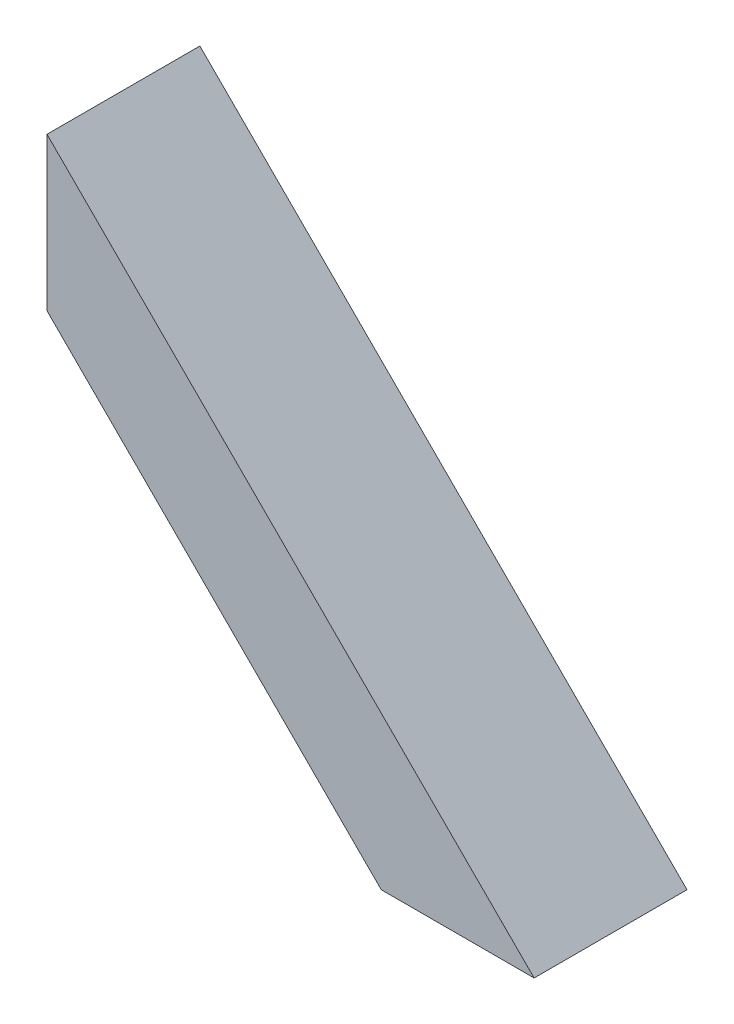
ISO-10303-21;
HEADER;
FILE_DESCRIPTION(('STEP AP214'),'2;1');
FILE_NAME('part.step','',(''),(''),'','','');
FILE_SCHEMA(('AUTOMOTIVE_DESIGN { 1 0 10303 214 1 1 1 1 }'));
ENDSEC;
DATA;
#1=APPLICATION_CONTEXT('core data for automotive mechanical design processes');
#2=APPLICATION_PROTOCOL_DEFINITION('international standard','automotive_design',2000,#1);
#3=PRODUCT_CONTEXT('',#1,'mechanical');
#4=PRODUCT('Part','Part','',(#3));
#5=PRODUCT_RELATED_PRODUCT_CATEGORY('part','',(#4));
#6=PRODUCT_DEFINITION_FORMATION('','',#4);
#7=PRODUCT_DEFINITION_CONTEXT('part definition',#1,'design');
#8=PRODUCT_DEFINITION('design','',#6,#7);
#9=PRODUCT_DEFINITION_SHAPE('','',#8);
#10=(LENGTH_UNIT() NAMED_UNIT(*) SI_UNIT(.MILLI.,.METRE.));
#11=(NAMED_UNIT(*) PLANE_ANGLE_UNIT() SI_UNIT($,.RADIAN.));
#12=(NAMED_UNIT(*) SI_UNIT($,.STERADIAN.) SOLID_ANGLE_UNIT());
#13=UNCERTAINTY_MEASURE_WITH_UNIT(LENGTH_MEASURE(1.E-05),#10,'distance_accuracy_value','');
#14=(GEOMETRIC_REPRESENTATION_CONTEXT(3) GLOBAL_UNCERTAINTY_ASSIGNED_CONTEXT((#13)) GLOBAL_UNIT_ASSIGNED_CONTEXT((#10,
#11,#12)) REPRESENTATION_CONTEXT('',''));
#15=CARTESIAN_POINT('',(0.,0.,0.));
#16=DIRECTION('',(0.,0.,1.));
#17=DIRECTION('',(1.,0.,0.));
#18=AXIS2_PLACEMENT_3D('',#15,#16,#17);
#19=CARTESIAN_POINT('',(8.74114267042818,-10.884186746988,5.));
#20=DIRECTION('',(-0.707106781186547,-0.707106781186548,0.));
#21=DIRECTION('',(0.707106781186548,-0.707106781186547,0.));
#22=AXIS2_PLACEMENT_3D('',#19,#20,#21);
#23=PLANE('',#22);
#24=DIRECTION('',(-0.707106781186548,0.707106781186547,0.));
#25=VECTOR('',#24,1.);
#26=CARTESIAN_POINT('',(8.74114267042818,-10.884186746988,0.));
#27=LINE('',#26,#25);
#28=CARTESIAN_POINT('',(8.74114267042818,-10.884186746988,0.));
#29=VERTEX_POINT('',#28);
#30=CARTESIAN_POINT('',(-7.19111445783132,5.04807038127153,0.));
#31=VERTEX_POINT('',#30);
#32=EDGE_CURVE('E107',#29,#31,#27,.T.);
#33=ORIENTED_EDGE('',*,*,#32,.T.);
#34=DIRECTION('',(0.,0.,-1.));
#35=VECTOR('',#34,1.);
#36=CARTESIAN_POINT('',(-7.19111445783132,5.04807038127153,5.));
#37=LINE('',#36,#35);
#38=CARTESIAN_POINT('',(-7.19111445783132,5.04807038127153,5.));
#39=VERTEX_POINT('',#38);
#40=EDGE_CURVE('E11',#39,#31,#37,.T.);
#41=ORIENTED_EDGE('',*,*,#40,.F.);
#42=DIRECTION('',(-0.707106781186548,0.707106781186547,0.));
#43=VECTOR('',#42,1.);
#44=CARTESIAN_POINT('',(8.74114267042818,-10.884186746988,5.));
#45=LINE('',#44,#43);
#46=CARTESIAN_POINT('',(8.74114267042818,-10.884186746988,5.));
#47=VERTEX_POINT('',#46);
#48=EDGE_CURVE('E91',#47,#39,#45,.T.);
#49=ORIENTED_EDGE('',*,*,#48,.F.);
#50=DIRECTION('',(0.,0.,-1.));
#51=VECTOR('',#50,1.);
#52=CARTESIAN_POINT('',(8.74114267042818,-10.884186746988,5.));
#53=LINE('',#52,#51);
#54=EDGE_CURVE('E103',#47,#29,#53,.T.);
#55=ORIENTED_EDGE('',*,*,#54,.T.);
#56=EDGE_LOOP('',(#33,#41,#49,#55));
#57=FACE_BOUND('',#56,.T.);
#58=ADVANCED_FACE('F39',(#57),#23,.F.);
#59=CARTESIAN_POINT('',(-7.19111445783132,5.04807038127153,5.));
#60=DIRECTION('',(1.,0.,0.));
#61=DIRECTION('',(0.,1.,0.));
#62=AXIS2_PLACEMENT_3D('',#59,#60,#61);
#63=PLANE('',#62);
#64=DIRECTION('',(0.,-1.,0.));
#65=VECTOR('',#64,1.);
#66=CARTESIAN_POINT('',(-7.19111445783132,5.04807038127153,0.));
#67=LINE('',#66,#65);
#68=CARTESIAN_POINT('',(-7.19111445783132,0.0480703812715316,0.));
#69=VERTEX_POINT('',#68);
#70=EDGE_CURVE('E96',#31,#69,#67,.T.);
#71=ORIENTED_EDGE('',*,*,#70,.T.);
#72=DIRECTION('',(0.,0.,-1.));
#73=VECTOR('',#72,1.);
#74=CARTESIAN_POINT('',(-7.19111445783132,0.0480703812715316,5.));
#75=LINE('',#74,#73);
#76=CARTESIAN_POINT('',(-7.19111445783132,0.0480703812715316,5.));
#77=VERTEX_POINT('',#76);
#78=EDGE_CURVE('E48',#77,#69,#75,.T.);
#79=ORIENTED_EDGE('',*,*,#78,.F.);
#80=DIRECTION('',(0.,-1.,0.));
#81=VECTOR('',#80,1.);
#82=CARTESIAN_POINT('',(-7.19111445783132,5.04807038127153,5.));
#83=LINE('',#82,#81);
#84=EDGE_CURVE('E86',#39,#77,#83,.T.);
#85=ORIENTED_EDGE('',*,*,#84,.F.);
#86=ORIENTED_EDGE('',*,*,#40,.T.);
#87=EDGE_LOOP('',(#71,#79,#85,#86));
#88=FACE_BOUND('',#87,.T.);
#89=ADVANCED_FACE('F95',(#88),#63,.F.);
#90=CARTESIAN_POINT('',(-7.19111445783132,0.0480703812715316,5.));
#91=DIRECTION('',(0.707106781186547,0.707106781186548,0.));
#92=DIRECTION('',(-0.707106781186548,0.707106781186547,0.));
#93=AXIS2_PLACEMENT_3D('',#90,#91,#92);
#94=PLANE('',#93);
#95=DIRECTION('',(0.707106781186548,-0.707106781186547,0.));
#96=VECTOR('',#95,1.);
#97=CARTESIAN_POINT('',(-7.19111445783132,0.0480703812715316,0.));
#98=LINE('',#97,#96);
#99=CARTESIAN_POINT('',(3.74114267042818,-10.884186746988,0.));
#100=VERTEX_POINT('',#99);
#101=EDGE_CURVE('E73',#69,#100,#98,.T.);
#102=ORIENTED_EDGE('',*,*,#101,.T.);
#103=DIRECTION('',(0.,0.,-1.));
#104=VECTOR('',#103,1.);
#105=CARTESIAN_POINT('',(3.74114267042818,-10.884186746988,5.));
#106=LINE('',#105,#104);
#107=CARTESIAN_POINT('',(3.74114267042818,-10.884186746988,5.));
#108=VERTEX_POINT('',#107);
#109=EDGE_CURVE('E98',#108,#100,#106,.T.);
#110=ORIENTED_EDGE('',*,*,#109,.F.);
#111=DIRECTION('',(0.707106781186548,-0.707106781186547,0.));
#112=VECTOR('',#111,1.);
#113=CARTESIAN_POINT('',(-7.19111445783132,0.0480703812715316,5.));
#114=LINE('',#113,#112);
#115=EDGE_CURVE('E89',#77,#108,#114,.T.);
#116=ORIENTED_EDGE('',*,*,#115,.F.);
#117=ORIENTED_EDGE('',*,*,#78,.T.);
#118=EDGE_LOOP('',(#102,#110,#116,#117));
#119=FACE_BOUND('',#118,.T.);
#120=ADVANCED_FACE('F99',(#119),#94,.F.);
#121=CARTESIAN_POINT('',(3.74114267042818,-10.884186746988,5.));
#122=DIRECTION('',(0.,1.,0.));
#123=DIRECTION('',(0.,0.,1.));
#124=AXIS2_PLACEMENT_3D('',#121,#122,#123);
#125=PLANE('',#124);
#126=DIRECTION('',(1.,0.,0.));
#127=VECTOR('',#126,1.);
#128=CARTESIAN_POINT('',(3.74114267042818,-10.884186746988,0.));
#129=LINE('',#128,#127);
#130=EDGE_CURVE('E79',#100,#29,#129,.T.);
#131=ORIENTED_EDGE('',*,*,#130,.T.);
#132=ORIENTED_EDGE('',*,*,#54,.F.);
#133=DIRECTION('',(1.,0.,0.));
#134=VECTOR('',#133,1.);
#135=CARTESIAN_POINT('',(3.74114267042818,-10.884186746988,5.));
#136=LINE('',#135,#134);
#137=EDGE_CURVE('E56',#108,#47,#136,.T.);
#138=ORIENTED_EDGE('',*,*,#137,.F.);
#139=ORIENTED_EDGE('',*,*,#109,.T.);
#140=EDGE_LOOP('',(#131,#132,#138,#139));
#141=FACE_BOUND('',#140,.T.);
#142=ADVANCED_FACE('F120',(#141),#125,.F.);
#143=CARTESIAN_POINT('',(0.,0.,5.));
#144=DIRECTION('',(0.,0.,1.));
#145=DIRECTION('',(1.,0.,0.));
#146=AXIS2_PLACEMENT_3D('',#143,#144,#145);
#147=PLANE('',#146);
#148=ORIENTED_EDGE('',*,*,#48,.T.);
#149=ORIENTED_EDGE('',*,*,#84,.T.);
#150=ORIENTED_EDGE('',*,*,#115,.T.);
#151=ORIENTED_EDGE('',*,*,#137,.T.);
#152=EDGE_LOOP('',(#148,#149,#150,#151));
#153=FACE_BOUND('',#152,.T.);
#154=ADVANCED_FACE('F87',(#153),#147,.T.);
#155=CARTESIAN_POINT('',(0.,0.,0.));
#156=DIRECTION('',(0.,0.,1.));
#157=DIRECTION('',(1.,0.,0.));
#158=AXIS2_PLACEMENT_3D('',#155,#156,#157);
#159=PLANE('',#158);
#160=ORIENTED_EDGE('',*,*,#32,.F.);
#161=ORIENTED_EDGE('',*,*,#130,.F.);
#162=ORIENTED_EDGE('',*,*,#101,.F.);
#163=ORIENTED_EDGE('',*,*,#70,.F.);
#164=EDGE_LOOP('',(#160,#161,#162,#163));
#165=FACE_BOUND('',#164,.T.);
#166=ADVANCED_FACE('F123',(#165),#159,.F.);
#167=CLOSED_SHELL('',(#58,#89,#120,#142,#154,#166));
#168=MANIFOLD_SOLID_BREP('B2',#167);
#169=ADVANCED_BREP_SHAPE_REPRESENTATION('',(#18,#168),#14);
#170=SHAPE_DEFINITION_REPRESENTATION(#9,#169);
ENDSEC;
END-ISO-10303-21;
